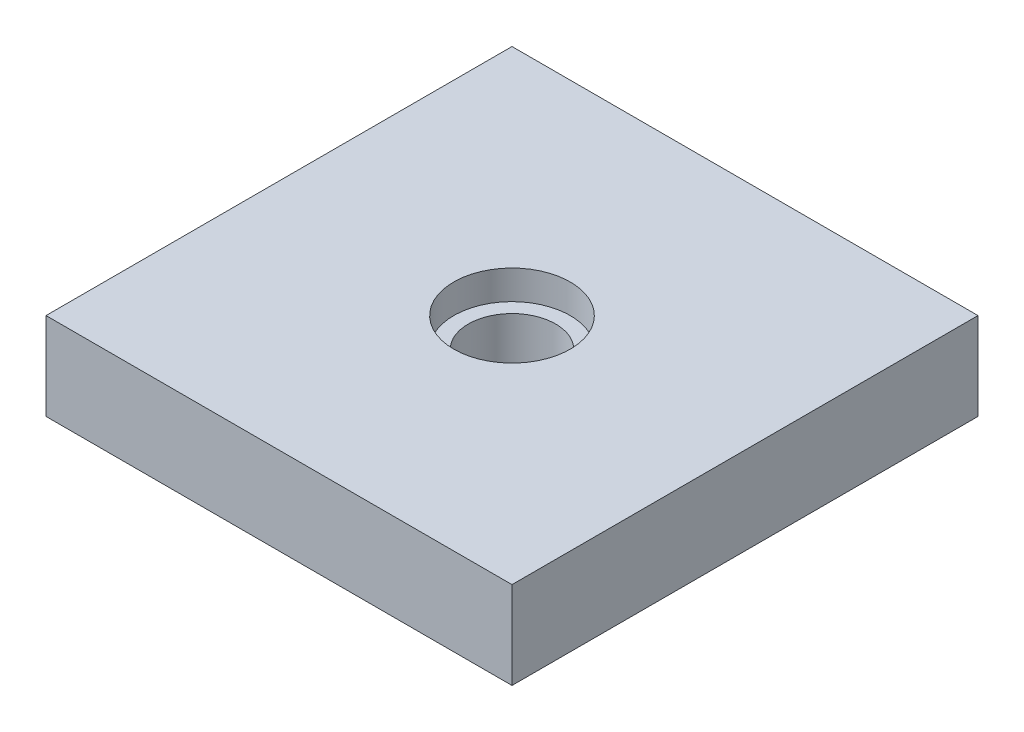
ISO-10303-21;
HEADER;
FILE_DESCRIPTION(('STEP AP214'),'2;1');
FILE_NAME('part.step','',(''),(''),'','','');
FILE_SCHEMA(('AUTOMOTIVE_DESIGN { 1 0 10303 214 1 1 1 1 }'));
ENDSEC;
DATA;
#1=APPLICATION_CONTEXT('core data for automotive mechanical design processes');
#2=APPLICATION_PROTOCOL_DEFINITION('international standard','automotive_design',2000,#1);
#3=PRODUCT_CONTEXT('',#1,'mechanical');
#4=PRODUCT('Part','Part','',(#3));
#5=PRODUCT_RELATED_PRODUCT_CATEGORY('part','',(#4));
#6=PRODUCT_DEFINITION_FORMATION('','',#4);
#7=PRODUCT_DEFINITION_CONTEXT('part definition',#1,'design');
#8=PRODUCT_DEFINITION('design','',#6,#7);
#9=PRODUCT_DEFINITION_SHAPE('','',#8);
#10=(LENGTH_UNIT() NAMED_UNIT(*) SI_UNIT(.MILLI.,.METRE.));
#11=(NAMED_UNIT(*) PLANE_ANGLE_UNIT() SI_UNIT($,.RADIAN.));
#12=(NAMED_UNIT(*) SI_UNIT($,.STERADIAN.) SOLID_ANGLE_UNIT());
#13=UNCERTAINTY_MEASURE_WITH_UNIT(LENGTH_MEASURE(1.E-05),#10,'distance_accuracy_value','');
#14=(GEOMETRIC_REPRESENTATION_CONTEXT(3) GLOBAL_UNCERTAINTY_ASSIGNED_CONTEXT((#13)) GLOBAL_UNIT_ASSIGNED_CONTEXT((#10,
#11,#12)) REPRESENTATION_CONTEXT('',''));
#15=CARTESIAN_POINT('',(0.,0.,0.));
#16=DIRECTION('',(0.,0.,1.));
#17=DIRECTION('',(1.,0.,0.));
#18=AXIS2_PLACEMENT_3D('',#15,#16,#17);
#19=CARTESIAN_POINT('',(-101.6,-38.1,101.6));
#20=DIRECTION('',(1.,0.,0.));
#21=DIRECTION('',(0.,0.,-1.));
#22=AXIS2_PLACEMENT_3D('',#19,#20,#21);
#23=PLANE('',#22);
#24=DIRECTION('',(0.,0.,-1.));
#25=VECTOR('',#24,1.);
#26=CARTESIAN_POINT('',(-101.6,0.,101.6));
#27=LINE('',#26,#25);
#28=CARTESIAN_POINT('',(-101.6,0.,101.6));
#29=VERTEX_POINT('',#28);
#30=CARTESIAN_POINT('',(-101.6,0.,-101.6));
#31=VERTEX_POINT('',#30);
#32=EDGE_CURVE('E96',#29,#31,#27,.T.);
#33=ORIENTED_EDGE('',*,*,#32,.T.);
#34=DIRECTION('',(0.,1.,0.));
#35=VECTOR('',#34,1.);
#36=CARTESIAN_POINT('',(-101.6,-38.1,-101.6));
#37=LINE('',#36,#35);
#38=CARTESIAN_POINT('',(-101.6,-38.1,-101.6));
#39=VERTEX_POINT('',#38);
#40=EDGE_CURVE('E11',#39,#31,#37,.T.);
#41=ORIENTED_EDGE('',*,*,#40,.F.);
#42=DIRECTION('',(0.,0.,-1.));
#43=VECTOR('',#42,1.);
#44=CARTESIAN_POINT('',(-101.6,-38.1,101.6));
#45=LINE('',#44,#43);
#46=CARTESIAN_POINT('',(-101.6,-38.1,101.6));
#47=VERTEX_POINT('',#46);
#48=EDGE_CURVE('E84',#47,#39,#45,.T.);
#49=ORIENTED_EDGE('',*,*,#48,.F.);
#50=DIRECTION('',(0.,1.,0.));
#51=VECTOR('',#50,1.);
#52=CARTESIAN_POINT('',(-101.6,-38.1,101.6));
#53=LINE('',#52,#51);
#54=EDGE_CURVE('E92',#47,#29,#53,.T.);
#55=ORIENTED_EDGE('',*,*,#54,.T.);
#56=EDGE_LOOP('',(#33,#41,#49,#55));
#57=FACE_BOUND('',#56,.T.);
#58=ADVANCED_FACE('F33',(#57),#23,.F.);
#59=CARTESIAN_POINT('',(101.6,-38.1,-101.6));
#60=DIRECTION('',(0.,0.,1.));
#61=DIRECTION('',(1.,0.,0.));
#62=AXIS2_PLACEMENT_3D('',#59,#60,#61);
#63=PLANE('',#62);
#64=DIRECTION('',(1.,0.,0.));
#65=VECTOR('',#64,1.);
#66=CARTESIAN_POINT('',(101.6,0.,-101.6));
#67=LINE('',#66,#65);
#68=CARTESIAN_POINT('',(101.6,0.,-101.6));
#69=VERTEX_POINT('',#68);
#70=EDGE_CURVE('E88',#31,#69,#67,.T.);
#71=ORIENTED_EDGE('',*,*,#70,.T.);
#72=DIRECTION('',(0.,1.,0.));
#73=VECTOR('',#72,1.);
#74=CARTESIAN_POINT('',(101.6,-38.1,-101.6));
#75=LINE('',#74,#73);
#76=CARTESIAN_POINT('',(101.6,-38.1,-101.6));
#77=VERTEX_POINT('',#76);
#78=EDGE_CURVE('E41',#77,#69,#75,.T.);
#79=ORIENTED_EDGE('',*,*,#78,.F.);
#80=DIRECTION('',(1.,0.,0.));
#81=VECTOR('',#80,1.);
#82=CARTESIAN_POINT('',(101.6,-38.1,-101.6));
#83=LINE('',#82,#81);
#84=EDGE_CURVE('E79',#39,#77,#83,.T.);
#85=ORIENTED_EDGE('',*,*,#84,.F.);
#86=ORIENTED_EDGE('',*,*,#40,.T.);
#87=EDGE_LOOP('',(#71,#79,#85,#86));
#88=FACE_BOUND('',#87,.T.);
#89=ADVANCED_FACE('F87',(#88),#63,.F.);
#90=CARTESIAN_POINT('',(101.6,-38.1,101.6));
#91=DIRECTION('',(-1.,0.,0.));
#92=DIRECTION('',(0.,0.,1.));
#93=AXIS2_PLACEMENT_3D('',#90,#91,#92);
#94=PLANE('',#93);
#95=DIRECTION('',(0.,0.,1.));
#96=VECTOR('',#95,1.);
#97=CARTESIAN_POINT('',(101.6,0.,101.6));
#98=LINE('',#97,#96);
#99=CARTESIAN_POINT('',(101.6,0.,101.6));
#100=VERTEX_POINT('',#99);
#101=EDGE_CURVE('E66',#69,#100,#98,.T.);
#102=ORIENTED_EDGE('',*,*,#101,.T.);
#103=DIRECTION('',(0.,1.,0.));
#104=VECTOR('',#103,1.);
#105=CARTESIAN_POINT('',(101.6,-38.1,101.6));
#106=LINE('',#105,#104);
#107=CARTESIAN_POINT('',(101.6,-38.1,101.6));
#108=VERTEX_POINT('',#107);
#109=EDGE_CURVE('E89',#108,#100,#106,.T.);
#110=ORIENTED_EDGE('',*,*,#109,.F.);
#111=DIRECTION('',(0.,0.,1.));
#112=VECTOR('',#111,1.);
#113=CARTESIAN_POINT('',(101.6,-38.1,101.6));
#114=LINE('',#113,#112);
#115=EDGE_CURVE('E82',#77,#108,#114,.T.);
#116=ORIENTED_EDGE('',*,*,#115,.F.);
#117=ORIENTED_EDGE('',*,*,#78,.T.);
#118=EDGE_LOOP('',(#102,#110,#116,#117));
#119=FACE_BOUND('',#118,.T.);
#120=ADVANCED_FACE('F90',(#119),#94,.F.);
#121=CARTESIAN_POINT('',(101.6,-38.1,101.6));
#122=DIRECTION('',(0.,0.,-1.));
#123=DIRECTION('',(-1.,0.,0.));
#124=AXIS2_PLACEMENT_3D('',#121,#122,#123);
#125=PLANE('',#124);
#126=DIRECTION('',(-1.,0.,0.));
#127=VECTOR('',#126,1.);
#128=CARTESIAN_POINT('',(101.6,0.,101.6));
#129=LINE('',#128,#127);
#130=EDGE_CURVE('E72',#100,#29,#129,.T.);
#131=ORIENTED_EDGE('',*,*,#130,.T.);
#132=ORIENTED_EDGE('',*,*,#54,.F.);
#133=DIRECTION('',(-1.,0.,0.));
#134=VECTOR('',#133,1.);
#135=CARTESIAN_POINT('',(101.6,-38.1,101.6));
#136=LINE('',#135,#134);
#137=EDGE_CURVE('E49',#108,#47,#136,.T.);
#138=ORIENTED_EDGE('',*,*,#137,.F.);
#139=ORIENTED_EDGE('',*,*,#109,.T.);
#140=EDGE_LOOP('',(#131,#132,#138,#139));
#141=FACE_BOUND('',#140,.T.);
#142=ADVANCED_FACE('F104',(#141),#125,.F.);
#143=CARTESIAN_POINT('',(0.,-38.1,0.));
#144=DIRECTION('',(0.,1.,0.));
#145=DIRECTION('',(0.,0.,1.));
#146=AXIS2_PLACEMENT_3D('',#143,#144,#145);
#147=PLANE('',#146);
#148=CARTESIAN_POINT('',(0.,-38.1,0.));
#149=DIRECTION('',(0.,1.,0.));
#150=DIRECTION('',(0.,0.,1.));
#151=AXIS2_PLACEMENT_3D('',#148,#149,#150);
#152=CIRCLE('',#151,19.05);
#153=CARTESIAN_POINT('',(0.,-38.1,19.05));
#154=VERTEX_POINT('',#153);
#155=EDGE_CURVE('E113',#154,#154,#152,.T.);
#156=ORIENTED_EDGE('',*,*,#155,.T.);
#157=EDGE_LOOP('',(#156));
#158=FACE_BOUND('',#157,.T.);
#159=ORIENTED_EDGE('',*,*,#48,.T.);
#160=ORIENTED_EDGE('',*,*,#84,.T.);
#161=ORIENTED_EDGE('',*,*,#115,.T.);
#162=ORIENTED_EDGE('',*,*,#137,.T.);
#163=EDGE_LOOP('',(#159,#160,#161,#162));
#164=FACE_BOUND('',#163,.T.);
#165=ADVANCED_FACE('F80',(#158,#164),#147,.F.);
#166=CARTESIAN_POINT('',(0.,0.,0.));
#167=DIRECTION('',(0.,1.,0.));
#168=DIRECTION('',(0.,0.,1.));
#169=AXIS2_PLACEMENT_3D('',#166,#167,#168);
#170=PLANE('',#169);
#171=CARTESIAN_POINT('',(0.,0.,0.));
#172=DIRECTION('',(0.,1.,0.));
#173=DIRECTION('',(0.,0.,1.));
#174=AXIS2_PLACEMENT_3D('',#171,#172,#173);
#175=CIRCLE('',#174,25.4);
#176=CARTESIAN_POINT('',(0.,0.,25.4));
#177=VERTEX_POINT('',#176);
#178=EDGE_CURVE('E110',#177,#177,#175,.T.);
#179=ORIENTED_EDGE('',*,*,#178,.F.);
#180=EDGE_LOOP('',(#179));
#181=FACE_BOUND('',#180,.T.);
#182=ORIENTED_EDGE('',*,*,#32,.F.);
#183=ORIENTED_EDGE('',*,*,#130,.F.);
#184=ORIENTED_EDGE('',*,*,#101,.F.);
#185=ORIENTED_EDGE('',*,*,#70,.F.);
#186=EDGE_LOOP('',(#182,#183,#184,#185));
#187=FACE_BOUND('',#186,.T.);
#188=ADVANCED_FACE('F107',(#181,#187),#170,.T.);
#189=CARTESIAN_POINT('',(0.,-12.7,0.));
#190=DIRECTION('',(0.,1.,0.));
#191=DIRECTION('',(0.,0.,1.));
#192=AXIS2_PLACEMENT_3D('',#189,#190,#191);
#193=CYLINDRICAL_SURFACE('',#192,25.4);
#194=CARTESIAN_POINT('',(0.,-12.7,0.));
#195=DIRECTION('',(0.,1.,0.));
#196=DIRECTION('',(0.,0.,1.));
#197=AXIS2_PLACEMENT_3D('',#194,#195,#196);
#198=CIRCLE('',#197,25.4);
#199=CARTESIAN_POINT('',(0.,-12.7,25.4));
#200=VERTEX_POINT('',#199);
#201=EDGE_CURVE('E99',#200,#200,#198,.T.);
#202=ORIENTED_EDGE('',*,*,#201,.F.);
#203=EDGE_LOOP('',(#202));
#204=FACE_BOUND('',#203,.T.);
#205=ORIENTED_EDGE('',*,*,#178,.T.);
#206=EDGE_LOOP('',(#205));
#207=FACE_BOUND('',#206,.T.);
#208=ADVANCED_FACE('F132',(#204,#207),#193,.F.);
#209=CARTESIAN_POINT('',(0.,-12.7,0.));
#210=DIRECTION('',(0.,1.,0.));
#211=DIRECTION('',(0.,0.,1.));
#212=AXIS2_PLACEMENT_3D('',#209,#210,#211);
#213=PLANE('',#212);
#214=CARTESIAN_POINT('',(0.,-12.7,0.));
#215=DIRECTION('',(0.,1.,0.));
#216=DIRECTION('',(0.,0.,1.));
#217=AXIS2_PLACEMENT_3D('',#214,#215,#216);
#218=CIRCLE('',#217,19.05);
#219=CARTESIAN_POINT('',(0.,-12.7,19.05));
#220=VERTEX_POINT('',#219);
#221=EDGE_CURVE('E116',#220,#220,#218,.T.);
#222=ORIENTED_EDGE('',*,*,#221,.F.);
#223=EDGE_LOOP('',(#222));
#224=FACE_BOUND('',#223,.T.);
#225=ORIENTED_EDGE('',*,*,#201,.T.);
#226=EDGE_LOOP('',(#225));
#227=FACE_BOUND('',#226,.T.);
#228=ADVANCED_FACE('F126',(#224,#227),#213,.T.);
#229=CARTESIAN_POINT('',(0.,-38.1,0.));
#230=DIRECTION('',(0.,1.,0.));
#231=DIRECTION('',(0.,0.,1.));
#232=AXIS2_PLACEMENT_3D('',#229,#230,#231);
#233=CYLINDRICAL_SURFACE('',#232,19.05);
#234=CARTESIAN_POINT('',(0.,-38.1,19.05));
#235=CARTESIAN_POINT('',(0.,-37.8354166666667,19.05));
#236=CARTESIAN_POINT('',(0.,-37.5708333333333,19.05));
#237=CARTESIAN_POINT('',(0.,-37.0416666666667,19.05));
#238=CARTESIAN_POINT('',(0.,-36.7770833333333,19.05));
#239=CARTESIAN_POINT('',(0.,-36.2479166666667,19.05));
#240=CARTESIAN_POINT('',(0.,-35.9833333333333,19.05));
#241=CARTESIAN_POINT('',(0.,-35.4541666666667,19.05));
#242=CARTESIAN_POINT('',(0.,-35.1895833333333,19.05));
#243=CARTESIAN_POINT('',(0.,-34.6604166666667,19.05));
#244=CARTESIAN_POINT('',(0.,-34.3958333333333,19.05));
#245=CARTESIAN_POINT('',(0.,-33.8666666666667,19.05));
#246=CARTESIAN_POINT('',(0.,-33.6020833333333,19.05));
#247=CARTESIAN_POINT('',(0.,-33.0729166666667,19.05));
#248=CARTESIAN_POINT('',(0.,-32.8083333333333,19.05));
#249=CARTESIAN_POINT('',(0.,-32.2791666666667,19.05));
#250=CARTESIAN_POINT('',(0.,-32.0145833333333,19.05));
#251=CARTESIAN_POINT('',(0.,-31.4854166666667,19.05));
#252=CARTESIAN_POINT('',(0.,-31.2208333333333,19.05));
#253=CARTESIAN_POINT('',(0.,-30.6916666666667,19.05));
#254=CARTESIAN_POINT('',(0.,-30.4270833333333,19.05));
#255=CARTESIAN_POINT('',(0.,-29.8979166666667,19.05));
#256=CARTESIAN_POINT('',(0.,-29.6333333333333,19.05));
#257=CARTESIAN_POINT('',(0.,-29.1041666666667,19.05));
#258=CARTESIAN_POINT('',(0.,-28.8395833333333,19.05));
#259=CARTESIAN_POINT('',(0.,-28.3104166666667,19.05));
#260=CARTESIAN_POINT('',(0.,-28.0458333333333,19.05));
#261=CARTESIAN_POINT('',(0.,-27.5166666666667,19.05));
#262=CARTESIAN_POINT('',(0.,-27.2520833333333,19.05));
#263=CARTESIAN_POINT('',(0.,-26.7229166666667,19.05));
#264=CARTESIAN_POINT('',(0.,-26.4583333333333,19.05));
#265=CARTESIAN_POINT('',(0.,-25.9291666666667,19.05));
#266=CARTESIAN_POINT('',(0.,-25.6645833333333,19.05));
#267=CARTESIAN_POINT('',(0.,-25.1354166666667,19.05));
#268=CARTESIAN_POINT('',(0.,-24.8708333333333,19.05));
#269=CARTESIAN_POINT('',(0.,-24.3416666666667,19.05));
#270=CARTESIAN_POINT('',(0.,-24.0770833333333,19.05));
#271=CARTESIAN_POINT('',(0.,-23.5479166666667,19.05));
#272=CARTESIAN_POINT('',(0.,-23.2833333333333,19.05));
#273=CARTESIAN_POINT('',(0.,-22.7541666666667,19.05));
#274=CARTESIAN_POINT('',(0.,-22.4895833333333,19.05));
#275=CARTESIAN_POINT('',(0.,-21.9604166666667,19.05));
#276=CARTESIAN_POINT('',(0.,-21.6958333333333,19.05));
#277=CARTESIAN_POINT('',(0.,-21.1666666666667,19.05));
#278=CARTESIAN_POINT('',(0.,-20.9020833333333,19.05));
#279=CARTESIAN_POINT('',(0.,-20.3729166666667,19.05));
#280=CARTESIAN_POINT('',(0.,-20.1083333333333,19.05));
#281=CARTESIAN_POINT('',(0.,-19.5791666666667,19.05));
#282=CARTESIAN_POINT('',(0.,-19.3145833333333,19.05));
#283=CARTESIAN_POINT('',(0.,-18.7854166666667,19.05));
#284=CARTESIAN_POINT('',(0.,-18.5208333333333,19.05));
#285=CARTESIAN_POINT('',(0.,-17.9916666666667,19.05));
#286=CARTESIAN_POINT('',(0.,-17.7270833333333,19.05));
#287=CARTESIAN_POINT('',(0.,-17.1979166666667,19.05));
#288=CARTESIAN_POINT('',(0.,-16.9333333333333,19.05));
#289=CARTESIAN_POINT('',(0.,-16.4041666666667,19.05));
#290=CARTESIAN_POINT('',(0.,-16.1395833333333,19.05));
#291=CARTESIAN_POINT('',(0.,-15.6104166666667,19.05));
#292=CARTESIAN_POINT('',(0.,-15.3458333333333,19.05));
#293=CARTESIAN_POINT('',(0.,-14.8166666666667,19.05));
#294=CARTESIAN_POINT('',(0.,-14.5520833333333,19.05));
#295=CARTESIAN_POINT('',(0.,-14.0229166666667,19.05));
#296=CARTESIAN_POINT('',(0.,-13.7583333333333,19.05));
#297=CARTESIAN_POINT('',(0.,-13.2291666666667,19.05));
#298=CARTESIAN_POINT('',(0.,-12.9645833333333,19.05));
#299=CARTESIAN_POINT('',(0.,-12.7,19.05));
#300=B_SPLINE_CURVE_WITH_KNOTS('',3,(#234,#235,#236,#237,#238,#239,#240,#241,#242,#243,#244,
#245,#246,#247,#248,#249,#250,#251,#252,#253,#254,#255,#256,#257,#258,#259,#260,#261,#262,#263,
#264,#265,#266,#267,#268,#269,#270,#271,#272,#273,#274,#275,#276,#277,#278,#279,#280,#281,#282,
#283,#284,#285,#286,#287,#288,#289,#290,#291,#292,#293,#294,#295,#296,#297,#298,#299),
.UNSPECIFIED.,.F.,.F.,(4,2,2,2,2,2,2,2,2,2,2,2,2,2,2,2,2,2,2,2,2,2,2,2,2,2,2,2,2,2,2,2,4),(0.,
0.793749999999996,1.5875,2.38124999999999,3.175,3.96875,4.7625,5.55625,6.35,7.14375,7.9375,
8.73125,9.525,10.31875,11.1125,11.90625,12.7,13.49375,14.2875,15.08125,15.875,16.66875,17.4625,
18.25625,19.05,19.84375,20.6375,21.43125,22.225,23.01875,23.8125,24.60625,25.4),.UNSPECIFIED.);
#301=EDGE_CURVE('BSEAM123',#154,#220,#300,.T.);
#302=ORIENTED_EDGE('',*,*,#155,.F.);
#303=ORIENTED_EDGE('',*,*,#221,.T.);
#304=ORIENTED_EDGE('',*,*,#301,.T.);
#305=ORIENTED_EDGE('',*,*,#301,.F.);
#306=EDGE_LOOP('',(#302,#304,#303,#305));
#307=FACE_BOUND('',#306,.T.);
#308=ADVANCED_FACE('F123',(#307),#233,.F.);
#309=CLOSED_SHELL('',(#58,#89,#120,#142,#165,#188,#208,#228,#308));
#310=MANIFOLD_SOLID_BREP('B2',#309);
#311=ADVANCED_BREP_SHAPE_REPRESENTATION('',(#18,#310),#14);
#312=SHAPE_DEFINITION_REPRESENTATION(#9,#311);
ENDSEC;
END-ISO-10303-21;
